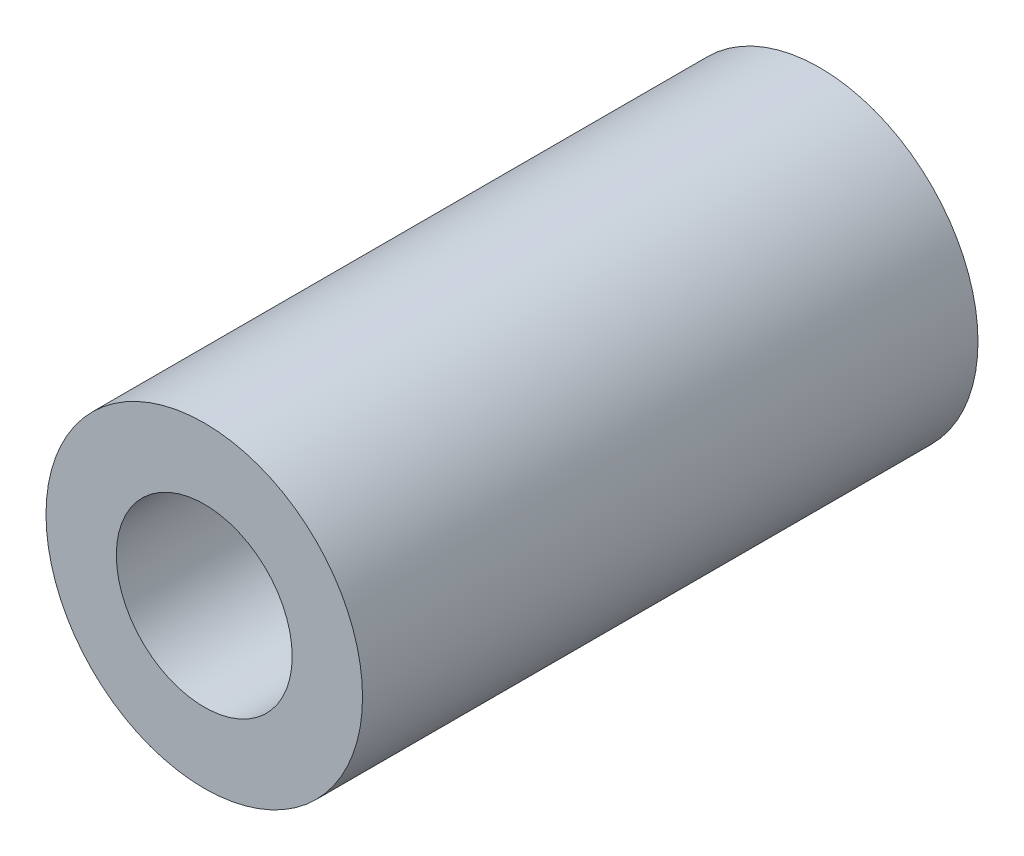
ISO-10303-21;
HEADER;
FILE_DESCRIPTION(('STEP AP214'),'2;1');
FILE_NAME('part.step','',(''),(''),'','','');
FILE_SCHEMA(('AUTOMOTIVE_DESIGN { 1 0 10303 214 1 1 1 1 }'));
ENDSEC;
DATA;
#1=APPLICATION_CONTEXT('core data for automotive mechanical design processes');
#2=APPLICATION_PROTOCOL_DEFINITION('international standard','automotive_design',2000,#1);
#3=PRODUCT_CONTEXT('',#1,'mechanical');
#4=PRODUCT('Part','Part','',(#3));
#5=PRODUCT_RELATED_PRODUCT_CATEGORY('part','',(#4));
#6=PRODUCT_DEFINITION_FORMATION('','',#4);
#7=PRODUCT_DEFINITION_CONTEXT('part definition',#1,'design');
#8=PRODUCT_DEFINITION('design','',#6,#7);
#9=PRODUCT_DEFINITION_SHAPE('','',#8);
#10=(LENGTH_UNIT() NAMED_UNIT(*) SI_UNIT(.MILLI.,.METRE.));
#11=(NAMED_UNIT(*) PLANE_ANGLE_UNIT() SI_UNIT($,.RADIAN.));
#12=(NAMED_UNIT(*) SI_UNIT($,.STERADIAN.) SOLID_ANGLE_UNIT());
#13=UNCERTAINTY_MEASURE_WITH_UNIT(LENGTH_MEASURE(1.E-05),#10,'distance_accuracy_value','');
#14=(GEOMETRIC_REPRESENTATION_CONTEXT(3) GLOBAL_UNCERTAINTY_ASSIGNED_CONTEXT((#13)) GLOBAL_UNIT_ASSIGNED_CONTEXT((#10,
#11,#12)) REPRESENTATION_CONTEXT('',''));
#15=CARTESIAN_POINT('',(0.,0.,0.));
#16=DIRECTION('',(0.,0.,1.));
#17=DIRECTION('',(1.,0.,0.));
#18=AXIS2_PLACEMENT_3D('',#15,#16,#17);
#19=CARTESIAN_POINT('',(0.,0.,35.));
#20=DIRECTION('',(0.,0.,1.));
#21=DIRECTION('',(1.,0.,0.));
#22=AXIS2_PLACEMENT_3D('',#19,#20,#21);
#23=PLANE('',#22);
#24=CARTESIAN_POINT('',(0.,0.,35.));
#25=DIRECTION('',(0.,0.,1.));
#26=DIRECTION('',(1.,0.,0.));
#27=AXIS2_PLACEMENT_3D('',#24,#25,#26);
#28=CIRCLE('',#27,9.);
#29=CARTESIAN_POINT('',(9.,0.,35.));
#30=VERTEX_POINT('',#29);
#31=EDGE_CURVE('E10',#30,#30,#28,.T.);
#32=ORIENTED_EDGE('',*,*,#31,.T.);
#33=EDGE_LOOP('',(#32));
#34=FACE_BOUND('',#33,.T.);
#35=CARTESIAN_POINT('',(0.,0.,35.));
#36=DIRECTION('',(0.,0.,1.));
#37=DIRECTION('',(1.,0.,0.));
#38=AXIS2_PLACEMENT_3D('',#35,#36,#37);
#39=CIRCLE('',#38,5.);
#40=CARTESIAN_POINT('',(5.,0.,35.));
#41=VERTEX_POINT('',#40);
#42=EDGE_CURVE('E50',#41,#41,#39,.T.);
#43=ORIENTED_EDGE('',*,*,#42,.F.);
#44=EDGE_LOOP('',(#43));
#45=FACE_BOUND('',#44,.T.);
#46=ADVANCED_FACE('F37',(#34,#45),#23,.T.);
#47=CARTESIAN_POINT('',(0.,0.,0.));
#48=DIRECTION('',(0.,0.,1.));
#49=DIRECTION('',(1.,0.,0.));
#50=AXIS2_PLACEMENT_3D('',#47,#48,#49);
#51=PLANE('',#50);
#52=CARTESIAN_POINT('',(0.,0.,0.));
#53=DIRECTION('',(0.,0.,1.));
#54=DIRECTION('',(1.,0.,0.));
#55=AXIS2_PLACEMENT_3D('',#52,#53,#54);
#56=CIRCLE('',#55,9.);
#57=CARTESIAN_POINT('',(9.,0.,0.));
#58=VERTEX_POINT('',#57);
#59=EDGE_CURVE('E41',#58,#58,#56,.T.);
#60=ORIENTED_EDGE('',*,*,#59,.F.);
#61=EDGE_LOOP('',(#60));
#62=FACE_BOUND('',#61,.T.);
#63=CARTESIAN_POINT('',(0.,0.,0.));
#64=DIRECTION('',(0.,0.,1.));
#65=DIRECTION('',(1.,0.,0.));
#66=AXIS2_PLACEMENT_3D('',#63,#64,#65);
#67=CIRCLE('',#66,5.);
#68=CARTESIAN_POINT('',(5.,0.,0.));
#69=VERTEX_POINT('',#68);
#70=EDGE_CURVE('E52',#69,#69,#67,.T.);
#71=ORIENTED_EDGE('',*,*,#70,.T.);
#72=EDGE_LOOP('',(#71));
#73=FACE_BOUND('',#72,.T.);
#74=ADVANCED_FACE('F64',(#62,#73),#51,.F.);
#75=CARTESIAN_POINT('',(0.,0.,35.));
#76=DIRECTION('',(0.,0.,-1.));
#77=DIRECTION('',(-1.,0.,0.));
#78=AXIS2_PLACEMENT_3D('',#75,#76,#77);
#79=CYLINDRICAL_SURFACE('',#78,9.);
#80=ORIENTED_EDGE('',*,*,#31,.F.);
#81=EDGE_LOOP('',(#80));
#82=FACE_BOUND('',#81,.T.);
#83=ORIENTED_EDGE('',*,*,#59,.T.);
#84=EDGE_LOOP('',(#83));
#85=FACE_BOUND('',#84,.T.);
#86=ADVANCED_FACE('F39',(#82,#85),#79,.T.);
#87=CARTESIAN_POINT('',(0.,0.,35.));
#88=DIRECTION('',(0.,0.,-1.));
#89=DIRECTION('',(-1.,0.,0.));
#90=AXIS2_PLACEMENT_3D('',#87,#88,#89);
#91=CYLINDRICAL_SURFACE('',#90,5.);
#92=ORIENTED_EDGE('',*,*,#42,.T.);
#93=EDGE_LOOP('',(#92));
#94=FACE_BOUND('',#93,.T.);
#95=ORIENTED_EDGE('',*,*,#70,.F.);
#96=EDGE_LOOP('',(#95));
#97=FACE_BOUND('',#96,.T.);
#98=ADVANCED_FACE('F60',(#94,#97),#91,.F.);
#99=CLOSED_SHELL('',(#46,#74,#86,#98));
#100=MANIFOLD_SOLID_BREP('B2',#99);
#101=ADVANCED_BREP_SHAPE_REPRESENTATION('',(#18,#100),#14);
#102=SHAPE_DEFINITION_REPRESENTATION(#9,#101);
ENDSEC;
END-ISO-10303-21;
